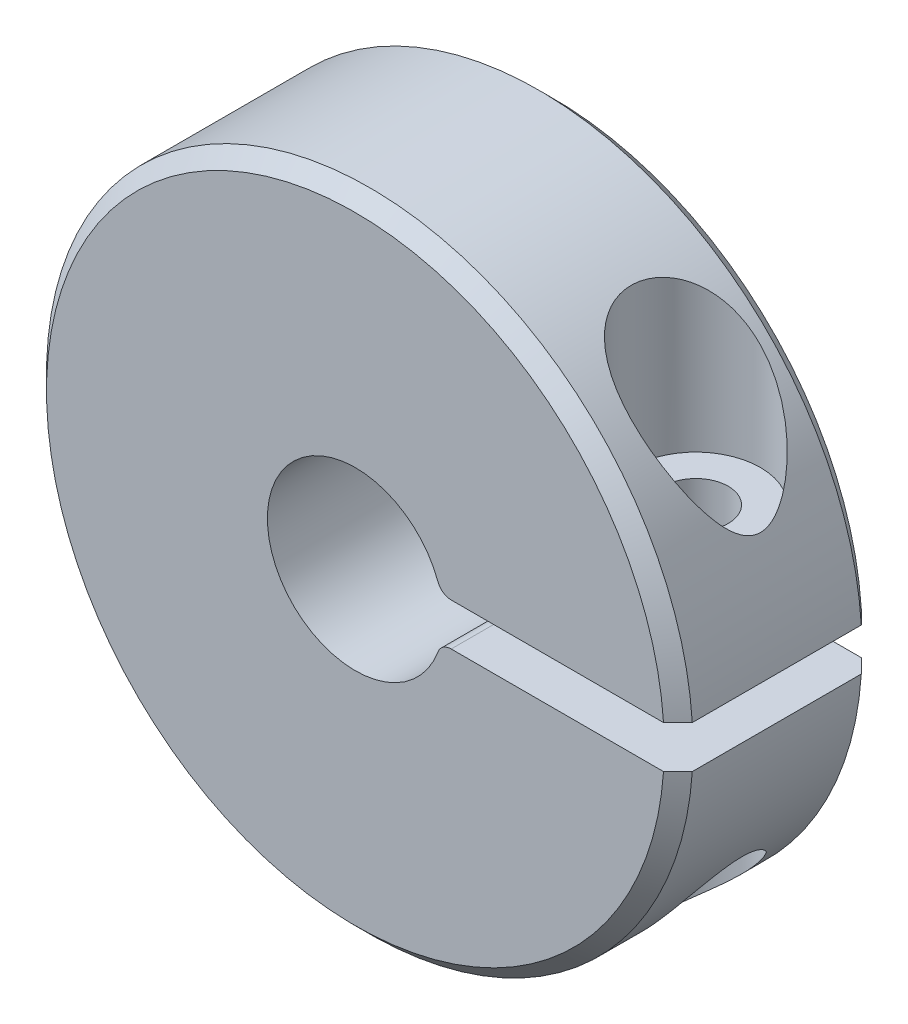
ISO-10303-21;
HEADER;
FILE_DESCRIPTION(('STEP AP214'),'2;1');
FILE_NAME('part.step','',(''),(''),'','','');
FILE_SCHEMA(('AUTOMOTIVE_DESIGN { 1 0 10303 214 1 1 1 1 }'));
ENDSEC;
DATA;
#1=APPLICATION_CONTEXT('core data for automotive mechanical design processes');
#2=APPLICATION_PROTOCOL_DEFINITION('international standard','automotive_design',2000,#1);
#3=PRODUCT_CONTEXT('',#1,'mechanical');
#4=PRODUCT('Part','Part','',(#3));
#5=PRODUCT_RELATED_PRODUCT_CATEGORY('part','',(#4));
#6=PRODUCT_DEFINITION_FORMATION('','',#4);
#7=PRODUCT_DEFINITION_CONTEXT('part definition',#1,'design');
#8=PRODUCT_DEFINITION('design','',#6,#7);
#9=PRODUCT_DEFINITION_SHAPE('','',#8);
#10=(LENGTH_UNIT() NAMED_UNIT(*) SI_UNIT(.MILLI.,.METRE.));
#11=(NAMED_UNIT(*) PLANE_ANGLE_UNIT() SI_UNIT($,.RADIAN.));
#12=(NAMED_UNIT(*) SI_UNIT($,.STERADIAN.) SOLID_ANGLE_UNIT());
#13=UNCERTAINTY_MEASURE_WITH_UNIT(LENGTH_MEASURE(1.E-05),#10,'distance_accuracy_value','');
#14=(GEOMETRIC_REPRESENTATION_CONTEXT(3) GLOBAL_UNCERTAINTY_ASSIGNED_CONTEXT((#13)) GLOBAL_UNIT_ASSIGNED_CONTEXT((#10,
#11,#12)) REPRESENTATION_CONTEXT('',''));
#15=CARTESIAN_POINT('',(0.,0.,0.));
#16=DIRECTION('',(0.,0.,1.));
#17=DIRECTION('',(1.,0.,0.));
#18=AXIS2_PLACEMENT_3D('',#15,#16,#17);
#19=CARTESIAN_POINT('',(0.,0.,0.));
#20=DIRECTION('',(0.,0.,1.));
#21=DIRECTION('',(1.,0.,0.));
#22=AXIS2_PLACEMENT_3D('',#19,#20,#21);
#23=PLANE('',#22);
#24=DIRECTION('',(-1.,0.,0.));
#25=VECTOR('',#24,1.);
#26=CARTESIAN_POINT('',(3.0197569852556,-0.75,0.));
#27=LINE('',#26,#25);
#28=CARTESIAN_POINT('',(10.9042377083407,-0.75,0.));
#29=VERTEX_POINT('',#28);
#30=CARTESIAN_POINT('',(3.38827865589594,-0.75,0.));
#31=VERTEX_POINT('',#30);
#32=EDGE_CURVE('E119',#29,#31,#27,.T.);
#33=ORIENTED_EDGE('',*,*,#32,.F.);
#34=CARTESIAN_POINT('',(0.,0.,0.));
#35=DIRECTION('',(0.,0.,1.));
#36=DIRECTION('',(1.,0.,0.));
#37=AXIS2_PLACEMENT_3D('',#34,#35,#36);
#38=CIRCLE('',#37,10.93);
#39=CARTESIAN_POINT('',(10.9042377083407,0.75,0.));
#40=VERTEX_POINT('',#39);
#41=EDGE_CURVE('E48',#29,#40,#38,.F.);
#42=ORIENTED_EDGE('',*,*,#41,.T.);
#43=DIRECTION('',(1.,0.,0.));
#44=VECTOR('',#43,1.);
#45=CARTESIAN_POINT('',(3.0197569852556,0.75,0.));
#46=LINE('',#45,#44);
#47=CARTESIAN_POINT('',(3.38827865589594,0.75,0.));
#48=VERTEX_POINT('',#47);
#49=EDGE_CURVE('E124',#48,#40,#46,.T.);
#50=ORIENTED_EDGE('',*,*,#49,.F.);
#51=CARTESIAN_POINT('',(3.38827865589594,1.25,0.));
#52=DIRECTION('',(0.,0.,1.));
#53=DIRECTION('',(1.,0.,0.));
#54=AXIS2_PLACEMENT_3D('',#51,#52,#53);
#55=CIRCLE('',#54,0.5);
#56=CARTESIAN_POINT('',(2.91918289846884,1.07694171396926,0.));
#57=VERTEX_POINT('',#56);
#58=EDGE_CURVE('E123',#48,#57,#55,.F.);
#59=ORIENTED_EDGE('',*,*,#58,.T.);
#60=CARTESIAN_POINT('',(0.,0.,0.));
#61=DIRECTION('',(0.,0.,-1.));
#62=DIRECTION('',(1.,0.,0.));
#63=AXIS2_PLACEMENT_3D('',#60,#61,#62);
#64=CIRCLE('',#63,3.1115);
#65=CARTESIAN_POINT('',(2.91918289846884,-1.07694171396926,0.));
#66=VERTEX_POINT('',#65);
#67=EDGE_CURVE('E109',#66,#57,#64,.T.);
#68=ORIENTED_EDGE('',*,*,#67,.F.);
#69=CARTESIAN_POINT('',(3.38827865589594,-1.25,0.));
#70=DIRECTION('',(0.,0.,1.));
#71=DIRECTION('',(1.,0.,0.));
#72=AXIS2_PLACEMENT_3D('',#69,#70,#71);
#73=CIRCLE('',#72,0.5);
#74=EDGE_CURVE('E140',#66,#31,#73,.F.);
#75=ORIENTED_EDGE('',*,*,#74,.T.);
#76=EDGE_LOOP('',(#33,#42,#50,#59,#68,#75));
#77=FACE_BOUND('',#76,.T.);
#78=ADVANCED_FACE('F34',(#77),#23,.F.);
#79=CARTESIAN_POINT('',(0.,0.,6.985));
#80=DIRECTION('',(0.,0.,-1.));
#81=DIRECTION('',(-1.,0.,0.));
#82=AXIS2_PLACEMENT_3D('',#79,#80,#81);
#83=CYLINDRICAL_SURFACE('',#82,3.1115);
#84=ORIENTED_EDGE('',*,*,#67,.T.);
#85=DIRECTION('',(0.,0.,-1.));
#86=VECTOR('',#85,1.);
#87=CARTESIAN_POINT('',(2.91918289846884,1.07694171396926,6.985));
#88=LINE('',#87,#86);
#89=CARTESIAN_POINT('',(2.91918289846884,1.07694171396926,6.985));
#90=VERTEX_POINT('',#89);
#91=EDGE_CURVE('E114',#57,#90,#88,.F.);
#92=ORIENTED_EDGE('',*,*,#91,.T.);
#93=CARTESIAN_POINT('',(0.,0.,6.985));
#94=DIRECTION('',(0.,0.,-1.));
#95=DIRECTION('',(1.,0.,0.));
#96=AXIS2_PLACEMENT_3D('',#93,#94,#95);
#97=CIRCLE('',#96,3.1115);
#98=CARTESIAN_POINT('',(2.91918289846884,-1.07694171396926,6.985));
#99=VERTEX_POINT('',#98);
#100=EDGE_CURVE('E391',#99,#90,#97,.T.);
#101=ORIENTED_EDGE('',*,*,#100,.F.);
#102=DIRECTION('',(0.,0.,-1.));
#103=VECTOR('',#102,1.);
#104=CARTESIAN_POINT('',(2.91918289846884,-1.07694171396926,6.985));
#105=LINE('',#104,#103);
#106=EDGE_CURVE('E117',#99,#66,#105,.T.);
#107=ORIENTED_EDGE('',*,*,#106,.T.);
#108=EDGE_LOOP('',(#84,#92,#101,#107));
#109=FACE_BOUND('',#108,.T.);
#110=ADVANCED_FACE('F111',(#109),#83,.F.);
#111=CARTESIAN_POINT('',(3.0197569852556,0.75,6.985));
#112=DIRECTION('',(0.,1.,0.));
#113=DIRECTION('',(0.,0.,1.));
#114=AXIS2_PLACEMENT_3D('',#111,#112,#113);
#115=PLANE('',#114);
#116=CARTESIAN_POINT('',(8.23036715761488,0.750000000000001,3.175));
#117=DIRECTION('',(0.,1.,0.));
#118=DIRECTION('',(0.,0.,1.));
#119=AXIS2_PLACEMENT_3D('',#116,#117,#118);
#120=CIRCLE('',#119,1.143);
#121=CARTESIAN_POINT('',(8.23036715761488,0.750000000000001,4.318));
#122=VERTEX_POINT('',#121);
#123=EDGE_CURVE('E120',#122,#122,#120,.T.);
#124=ORIENTED_EDGE('',*,*,#123,.T.);
#125=EDGE_LOOP('',(#124));
#126=FACE_BOUND('',#125,.T.);
#127=ORIENTED_EDGE('',*,*,#49,.T.);
#128=CARTESIAN_POINT('',(10.9042377083407,0.75,0.));
#129=CARTESIAN_POINT('',(10.9877634973014,0.75,0.0833291097349452));
#130=CARTESIAN_POINT('',(11.0712871792218,0.75,0.166660331269681));
#131=CARTESIAN_POINT('',(11.2383303289798,0.75,0.333326997936349));
#132=CARTESIAN_POINT('',(11.3218497968174,0.75,0.416662443068283));
#133=CARTESIAN_POINT('',(11.4053671576149,0.75,0.500000000000006));
#134=B_SPLINE_CURVE_WITH_KNOTS('',3,(#128,#129,#130,#131,#132,#133),.UNSPECIFIED.,.F.,.F.,(4,2,
4),(0.,0.353952936583566,0.707905873157012),.UNSPECIFIED.);
#135=CARTESIAN_POINT('',(11.4053671576149,0.75,0.500000000000006));
#136=VERTEX_POINT('',#135);
#137=EDGE_CURVE('E11',#40,#136,#134,.T.);
#138=ORIENTED_EDGE('',*,*,#137,.T.);
#139=DIRECTION('',(0.,0.,-1.));
#140=VECTOR('',#139,1.);
#141=CARTESIAN_POINT('',(11.4053671576149,0.75,6.985));
#142=LINE('',#141,#140);
#143=CARTESIAN_POINT('',(11.4053671576149,0.75,6.47699999999999));
#144=VERTEX_POINT('',#143);
#145=EDGE_CURVE('E369',#144,#136,#142,.T.);
#146=ORIENTED_EDGE('',*,*,#145,.F.);
#147=CARTESIAN_POINT('',(11.4053671576149,0.75,6.47699999999999));
#148=CARTESIAN_POINT('',(11.3205134517311,0.75,6.56167103127841));
#149=CARTESIAN_POINT('',(11.2356575684629,0.75,6.64633988025031));
#150=CARTESIAN_POINT('',(11.0659414471552,0.75,6.81567321358365));
#151=CARTESIAN_POINT('',(10.9810812091156,0.75,6.90033769794508));
#152=CARTESIAN_POINT('',(10.8962187936917,0.75,6.985));
#153=B_SPLINE_CURVE_WITH_KNOTS('',3,(#147,#148,#149,#150,#151,#152),.UNSPECIFIED.,.F.,.F.,(4,2,
4),(0.,0.359616482107068,0.719232964224946),.UNSPECIFIED.);
#154=CARTESIAN_POINT('',(10.8962187936917,0.75,6.985));
#155=VERTEX_POINT('',#154);
#156=EDGE_CURVE('E186',#144,#155,#153,.T.);
#157=ORIENTED_EDGE('',*,*,#156,.T.);
#158=DIRECTION('',(1.,0.,0.));
#159=VECTOR('',#158,1.);
#160=CARTESIAN_POINT('',(3.0197569852556,0.75,6.985));
#161=LINE('',#160,#159);
#162=CARTESIAN_POINT('',(3.38827865589594,0.75,6.985));
#163=VERTEX_POINT('',#162);
#164=EDGE_CURVE('E384',#163,#155,#161,.T.);
#165=ORIENTED_EDGE('',*,*,#164,.F.);
#166=DIRECTION('',(0.,0.,-1.));
#167=VECTOR('',#166,1.);
#168=CARTESIAN_POINT('',(3.38827865589594,0.75,6.985));
#169=LINE('',#168,#167);
#170=EDGE_CURVE('E135',#163,#48,#169,.T.);
#171=ORIENTED_EDGE('',*,*,#170,.T.);
#172=EDGE_LOOP('',(#127,#138,#146,#157,#165,#171));
#173=FACE_BOUND('',#172,.T.);
#174=ADVANCED_FACE('F192',(#126,#173),#115,.F.);
#175=CARTESIAN_POINT('',(0.,0.,6.985));
#176=DIRECTION('',(0.,0.,-1.));
#177=DIRECTION('',(-1.,0.,0.));
#178=AXIS2_PLACEMENT_3D('',#175,#176,#177);
#179=CYLINDRICAL_SURFACE('',#178,11.43);
#180=CARTESIAN_POINT('',(8.23036715761488,-7.93132753395385,4.953));
#181=CARTESIAN_POINT('',(8.30498156702307,-7.85390060478297,4.95300015319294));
#182=CARTESIAN_POINT('',(8.37848766170207,-7.77543076387292,4.94831035981302));
#183=CARTESIAN_POINT('',(8.52278199487194,-7.61699217717442,4.93029625105767));
#184=CARTESIAN_POINT('',(8.59356979106828,-7.53702319058366,4.91697053678377));
#185=CARTESIAN_POINT('',(8.73240097449314,-7.37573434677353,4.8821600841793));
#186=CARTESIAN_POINT('',(8.80042778952019,-7.29440957074977,4.86063238925259));
#187=CARTESIAN_POINT('',(8.93302330834566,-7.13141145130914,4.80980854405525));
#188=CARTESIAN_POINT('',(8.99759287854975,-7.04973820081397,4.78051435117024));
#189=CARTESIAN_POINT('',(9.12456815557469,-6.8846396360857,4.71349588596624));
#190=CARTESIAN_POINT('',(9.18688227898052,-6.8012203408616,4.67558290897706));
#191=CARTESIAN_POINT('',(9.30736937209283,-6.63538101006212,4.59159779358892));
#192=CARTESIAN_POINT('',(9.36553948524012,-6.55296169565356,4.54552010192906));
#193=CARTESIAN_POINT('',(9.4769159509464,-6.39081957359175,4.44503678667072));
#194=CARTESIAN_POINT('',(9.53015196260096,-6.31108277796456,4.39068692833612));
#195=CARTESIAN_POINT('',(9.63137096654851,-6.15549811581259,4.27250931045424));
#196=CARTESIAN_POINT('',(9.67936293591305,-6.07964372539096,4.20869820318048));
#197=CARTESIAN_POINT('',(9.75324731376263,-5.96004609972014,4.09423239346201));
#198=CARTESIAN_POINT('',(9.7809898409012,-5.91436654782216,4.04680545030249));
#199=CARTESIAN_POINT('',(9.83324515467069,-5.82707227063173,3.94653549681379));
#200=CARTESIAN_POINT('',(9.85775468339499,-5.78546165638135,3.89368711715825));
#201=CARTESIAN_POINT('',(9.90288527942073,-5.70787156167318,3.78136355874434));
#202=CARTESIAN_POINT('',(9.92345826443013,-5.6719625251615,3.72181901083114));
#203=CARTESIAN_POINT('',(9.95891192525704,-5.60948044989559,3.59644962915283));
#204=CARTESIAN_POINT('',(9.97380999941738,-5.58287889669798,3.53064477662695));
#205=CARTESIAN_POINT('',(9.99277857817222,-5.54883193657383,3.41480962840096));
#206=CARTESIAN_POINT('',(9.99876580717983,-5.53801816257598,3.36609252106549));
#207=CARTESIAN_POINT('',(10.0066601306054,-5.52374178058576,3.26727529213453));
#208=CARTESIAN_POINT('',(10.0085714009144,-5.52027164893144,3.21717663932785));
#209=CARTESIAN_POINT('',(10.0081277217503,-5.52107592425294,3.11700270312292));
#210=CARTESIAN_POINT('',(10.0057676416535,-5.52535964493488,3.06692752019293));
#211=CARTESIAN_POINT('',(9.99700769379174,-5.54119261630438,2.96830045573627));
#212=CARTESIAN_POINT('',(9.99060381493081,-5.5527490808816,2.91975013699425));
#213=CARTESIAN_POINT('',(9.97169106662201,-5.58665877594799,2.81021698289553));
#214=CARTESIAN_POINT('',(9.95789105066927,-5.61127223811481,2.75016629407419));
#215=CARTESIAN_POINT('',(9.92553435821117,-5.66831082275655,2.63530181941104));
#216=CARTESIAN_POINT('',(9.9069665675598,-5.70075418672408,2.58050068627806));
#217=CARTESIAN_POINT('',(9.85299884609691,-5.79376682196334,2.4422687217776));
#218=CARTESIAN_POINT('',(9.81447491265942,-5.85896451457133,2.36321793732949));
#219=CARTESIAN_POINT('',(9.73047284261003,-5.99745221334292,2.21682062110648));
#220=CARTESIAN_POINT('',(9.68497500496431,-6.07076497595306,2.14950843964278));
#221=CARTESIAN_POINT('',(9.59393206979153,-6.21351114598652,2.03182349501006));
#222=CARTESIAN_POINT('',(9.54896499676116,-6.2824569472025,1.98039751909401));
#223=CARTESIAN_POINT('',(9.45525586749231,-6.42262823011024,1.8844843367477));
#224=CARTESIAN_POINT('',(9.4065111029821,-6.49385532541913,1.84000217858842));
#225=CARTESIAN_POINT('',(9.30558210452859,-6.63767801250218,1.75745006784683));
#226=CARTESIAN_POINT('',(9.25339473281035,-6.71027480844339,1.71938608068421));
#227=CARTESIAN_POINT('',(9.14586140062951,-6.85611652228672,1.64946159809621));
#228=CARTESIAN_POINT('',(9.09051504942555,-6.92936151941544,1.61760187224968));
#229=CARTESIAN_POINT('',(8.97360515710522,-7.08017766228679,1.55839390555201));
#230=CARTESIAN_POINT('',(8.91186707647607,-7.15775664109912,1.53140791471579));
#231=CARTESIAN_POINT('',(8.78532637842617,-7.31252130478226,1.48447979018282));
#232=CARTESIAN_POINT('',(8.72052328008479,-7.38970692581397,1.46453876607107));
#233=CARTESIAN_POINT('',(8.52201416226555,-7.61977317575457,1.41579933585821));
#234=CARTESIAN_POINT('',(8.38394797035212,-7.77150075150451,1.39795126584669));
#235=CARTESIAN_POINT('',(8.1297251822334,-8.03609249868624,1.39631572617285));
#236=CARTESIAN_POINT('',(8.01509266325347,-8.15040167635492,1.40613596920461));
#237=CARTESIAN_POINT('',(7.78345423013067,-8.37187166807832,1.45006324904879));
#238=CARTESIAN_POINT('',(7.66645143411815,-8.47904116740095,1.48414016555304));
#239=CARTESIAN_POINT('',(7.46138299809849,-8.65949549899148,1.56899058559326));
#240=CARTESIAN_POINT('',(7.37285617312702,-8.73490149368641,1.61411481845311));
#241=CARTESIAN_POINT('',(7.20029143832689,-8.8776783532427,1.72222419802365));
#242=CARTESIAN_POINT('',(7.11624777284196,-8.94505966461449,1.78518575503406));
#243=CARTESIAN_POINT('',(6.97167826059411,-9.05800324389113,1.91617014740094));
#244=CARTESIAN_POINT('',(6.90968534123564,-9.10529286953045,1.98107459169682));
#245=CARTESIAN_POINT('',(6.79419318404309,-9.19179196293739,2.12284389575808));
#246=CARTESIAN_POINT('',(6.74069176232339,-9.23100350904132,2.19970567017529));
#247=CARTESIAN_POINT('',(6.64482062781051,-9.30025814618255,2.36475617285975));
#248=CARTESIAN_POINT('',(6.60253501609675,-9.33023222730692,2.45302348208646));
#249=CARTESIAN_POINT('',(6.53253569691038,-9.3793780658839,2.63796990936962));
#250=CARTESIAN_POINT('',(6.50481106470971,-9.39855792274061,2.73464265738475));
#251=CARTESIAN_POINT('',(6.4685339805702,-9.42355483010859,2.92007640609214));
#252=CARTESIAN_POINT('',(6.4579783226267,-9.43077046232767,3.0082614623287));
#253=CARTESIAN_POINT('',(6.45019100170494,-9.43609903797309,3.18547594998551));
#254=CARTESIAN_POINT('',(6.45295315241619,-9.434216207763,3.27450497019503));
#255=CARTESIAN_POINT('',(6.47099280118947,-9.42184974245136,3.44467881399599));
#256=CARTESIAN_POINT('',(6.48543444379719,-9.41194045782524,3.52595683904352));
#257=CARTESIAN_POINT('',(6.52498057260347,-9.38456722641019,3.68452717372675));
#258=CARTESIAN_POINT('',(6.55008499952599,-9.36710332161853,3.76181950551685));
#259=CARTESIAN_POINT('',(6.61046951277237,-9.32459016330615,3.91254967265607));
#260=CARTESIAN_POINT('',(6.64599669854337,-9.29935587051818,3.98583548242593));
#261=CARTESIAN_POINT('',(6.72526760034605,-9.24218913138089,4.1249345259963));
#262=CARTESIAN_POINT('',(6.76901345213371,-9.21025494370098,4.19074581026911));
#263=CARTESIAN_POINT('',(6.86782350412642,-9.13685140617761,4.32045845149699));
#264=CARTESIAN_POINT('',(6.92359065399147,-9.0947371026394,4.38345633929457));
#265=CARTESIAN_POINT('',(7.04072342703567,-9.00436597668912,4.49893818672953));
#266=CARTESIAN_POINT('',(7.10209325451338,-8.95610453049541,4.55141415466344));
#267=CARTESIAN_POINT('',(7.25739819521559,-8.83113612272893,4.66759498647417));
#268=CARTESIAN_POINT('',(7.35338400673661,-8.75151864654828,4.72544910699523));
#269=CARTESIAN_POINT('',(7.54825962205226,-8.58401184268237,4.82054406336446));
#270=CARTESIAN_POINT('',(7.64715351861821,-8.49611043137558,4.85775422428423));
#271=CARTESIAN_POINT('',(7.82773885706582,-8.32969732868684,4.90890417184893));
#272=CARTESIAN_POINT('',(7.90950760998705,-8.25211608066446,4.92571743715657));
#273=CARTESIAN_POINT('',(8.07138500208836,-8.09385196481786,4.94775924729684));
#274=CARTESIAN_POINT('',(8.15149528141126,-8.01317241111403,4.95299983806592));
#275=CARTESIAN_POINT('',(8.23036715761488,-7.93132753395385,4.953));
#276=B_SPLINE_CURVE_WITH_KNOTS('',3,(#180,#181,#182,#183,#184,#185,#186,#187,#188,#189,#190,
#191,#192,#193,#194,#195,#196,#197,#198,#199,#200,#201,#202,#203,#204,#205,#206,#207,#208,#209,
#210,#211,#212,#213,#214,#215,#216,#217,#218,#219,#220,#221,#222,#223,#224,#225,#226,#227,#228,
#229,#230,#231,#232,#233,#234,#235,#236,#237,#238,#239,#240,#241,#242,#243,#244,#245,#246,#247,
#248,#249,#250,#251,#252,#253,#254,#255,#256,#257,#258,#259,#260,#261,#262,#263,#264,#265,#266,
#267,#268,#269,#270,#271,#272,#273,#274,#275),.UNSPECIFIED.,.T.,.F.,(4,2,2,2,2,2,2,2,2,2,2,2,2,
2,2,2,2,2,2,2,2,2,2,2,2,2,2,2,2,2,2,2,2,2,2,2,2,2,2,2,2,2,2,2,2,2,2,4),(0.,0.322458365177513,
0.644968977163604,0.969192438749432,1.29333426405003,1.62540605290451,1.95770457468846,
2.28785481221118,2.61743071892641,2.83149164087188,3.04576665134073,3.2625117721797,
3.47858693481694,3.62873318291014,3.77872552950081,3.92889816219173,4.07921998754059,
4.27714858291146,4.47554282533674,4.80212534606118,5.12964805876159,5.4204240981171,
5.71141056170902,6.00266601167231,6.2939575660894,6.6019093241029,6.90990956303729,
7.52458295771677,8.00955761180689,8.49393110510569,8.86680315109142,9.23918436081881,
9.54231867905976,9.84537490893384,10.1506431570738,10.455682041933,10.7215898159569,
10.9873740839619,11.2356617712811,11.4839480783493,11.7386759171658,11.9934700430063,
12.2746485587357,12.556039835404,12.9662013883831,13.3769707805394,13.7181838189237,
14.0590415226947),.UNSPECIFIED.);
#277=CARTESIAN_POINT('',(9.30991895442998,-6.63101116436592,1.76225376730522));
#278=VERTEX_POINT('',#277);
#279=CARTESIAN_POINT('',(9.30991895442998,-6.63101116436592,4.58774623269477));
#280=VERTEX_POINT('',#279);
#281=EDGE_CURVE('E357',#278,#280,#276,.T.);
#282=ORIENTED_EDGE('',*,*,#281,.T.);
#283=CARTESIAN_POINT('',(9.30991895442998,-6.63101116436592,4.58774623269477));
#284=CARTESIAN_POINT('',(9.34860172966801,-6.57671563210915,4.54609376829998));
#285=CARTESIAN_POINT('',(9.38605578494384,-6.52310989177789,4.50228442355549));
#286=CARTESIAN_POINT('',(9.45834710551006,-6.41783594975969,4.40971164153865));
#287=CARTESIAN_POINT('',(9.49316914417179,-6.366179777092,4.36092272400773));
#288=CARTESIAN_POINT('',(9.56031316886299,-6.26490939746152,4.25710681842663));
#289=CARTESIAN_POINT('',(9.59256681044042,-6.21536136978365,4.20196983346022));
#290=CARTESIAN_POINT('',(9.6530444055302,-6.1210096111039,4.08592465814862));
#291=CARTESIAN_POINT('',(9.68127794462705,-6.07619466276216,4.02503079230288));
#292=CARTESIAN_POINT('',(9.7303705828982,-5.99722752316016,3.90315250536489));
#293=CARTESIAN_POINT('',(9.75168016687586,-5.96246186703214,3.84275496733393));
#294=CARTESIAN_POINT('',(9.78930955715886,-5.9004770861403,3.71700481993354));
#295=CARTESIAN_POINT('',(9.80565090708278,-5.87322542796712,3.65167518348863));
#296=CARTESIAN_POINT('',(9.83249975346793,-5.82816932186818,3.5155156615809));
#297=CARTESIAN_POINT('',(9.84292201155361,-5.81050306292386,3.44462136654043));
#298=CARTESIAN_POINT('',(9.85643766165185,-5.78754972308014,3.30015302539001));
#299=CARTESIAN_POINT('',(9.85953897096054,-5.78224926915888,3.22658196163833));
#300=CARTESIAN_POINT('',(9.85813233071163,-5.78464494899835,3.08925117997719));
#301=CARTESIAN_POINT('',(9.85455220420418,-5.79075642098756,3.02544719014042));
#302=CARTESIAN_POINT('',(9.84191009535912,-5.81221616863945,2.89997452434056));
#303=CARTESIAN_POINT('',(9.83284354895811,-5.82757213459135,2.83830767143301));
#304=CARTESIAN_POINT('',(9.80652387688038,-5.87178198768337,2.70049605395609));
#305=CARTESIAN_POINT('',(9.78763383253516,-5.90329843036484,2.62553296057192));
#306=CARTESIAN_POINT('',(9.7435206993415,-5.9758262260781,2.48232802069673));
#307=CARTESIAN_POINT('',(9.71828074845739,-6.01686283674663,2.41410475431334));
#308=CARTESIAN_POINT('',(9.66824573129171,-6.09686035995054,2.29697780162483));
#309=CARTESIAN_POINT('',(9.64431694582055,-6.13467556728593,2.24689580457777));
#310=CARTESIAN_POINT('',(9.59372170236389,-6.21350117956463,2.15075055925225));
#311=CARTESIAN_POINT('',(9.56705333308694,-6.2545138103392,2.10469015868747));
#312=CARTESIAN_POINT('',(9.51136012286483,-6.33888684250905,2.01633816204592));
#313=CARTESIAN_POINT('',(9.48233553576318,-6.38224699083094,1.97404616101344));
#314=CARTESIAN_POINT('',(9.42219380465488,-6.47070482657358,1.89296876452814));
#315=CARTESIAN_POINT('',(9.39107751227144,-6.51580180370082,1.85418195685945));
#316=CARTESIAN_POINT('',(9.34288010174064,-6.58454904931113,1.79836570373282));
#317=CARTESIAN_POINT('',(9.32651454980965,-6.60771199297185,1.78010855491138));
#318=CARTESIAN_POINT('',(9.30991895442998,-6.63101116436592,1.76225376730523));
#319=B_SPLINE_CURVE_WITH_KNOTS('',3,(#283,#284,#285,#286,#287,#288,#289,#290,#291,#292,#293,
#294,#295,#296,#297,#298,#299,#300,#301,#302,#303,#304,#305,#306,#307,#308,#309,#310,#311,#312,
#313,#314,#315,#316,#317,#318),.UNSPECIFIED.,.F.,.F.,(4,2,2,2,2,2,2,2,2,2,2,2,2,2,2,2,2,4),(0.,
0.23587557875659,0.47302518249813,0.715184031854365,0.956755442025457,1.17479016876487,
1.39186549047713,1.6119923386014,1.83188101958039,2.02347388333752,2.2152263496073,
2.46429129579014,2.71402474129635,2.91523895533362,3.11659451383761,3.31792840832493,
3.51918082186805,3.62035073833998),.UNSPECIFIED.);
#320=EDGE_CURVE('E371',#280,#278,#319,.T.);
#321=ORIENTED_EDGE('',*,*,#320,.T.);
#322=EDGE_LOOP('',(#282,#321));
#323=FACE_BOUND('',#322,.T.);
#324=CARTESIAN_POINT('',(8.23036715761488,7.93132753395385,0.889));
#325=CARTESIAN_POINT('',(8.32636414962857,7.83172121993594,0.888997693683112));
#326=CARTESIAN_POINT('',(8.42046203131274,7.7304431295408,0.895032139815843));
#327=CARTESIAN_POINT('',(8.60439554966201,7.52517302696768,0.917903948622648));
#328=CARTESIAN_POINT('',(8.69422956666565,7.42118000638814,0.934745381695788));
#329=CARTESIAN_POINT('',(8.86921657101917,7.21114584585052,0.978227385988428));
#330=CARTESIAN_POINT('',(8.95436374995744,7.10510237521625,1.0048798150848));
#331=CARTESIAN_POINT('',(9.11958311106477,6.8917560175368,1.06718501908089));
#332=CARTESIAN_POINT('',(9.19965608519275,6.7844533301382,1.10283638511745));
#333=CARTESIAN_POINT('',(9.35720749289252,6.56554422561263,1.18398318666731));
#334=CARTESIAN_POINT('',(9.43450356591628,6.45391611542811,1.22977356321609));
#335=CARTESIAN_POINT('',(9.58333093177759,6.23078218692261,1.33018386899146));
#336=CARTESIAN_POINT('',(9.65486216933496,6.11927636978443,1.38480388287213));
#337=CARTESIAN_POINT('',(9.79201093308256,5.89732575168005,1.50309283295238));
#338=CARTESIAN_POINT('',(9.85762522131269,5.78688156085243,1.56676667520022));
#339=CARTESIAN_POINT('',(9.98256425708172,5.56857886781973,1.70387190258062));
#340=CARTESIAN_POINT('',(10.0418943529837,5.46071822830573,1.7772948684835));
#341=CARTESIAN_POINT('',(10.1273271995056,5.29963602326673,1.89830508406929));
#342=CARTESIAN_POINT('',(10.1559134934601,5.24461708216047,1.94176376929039));
#343=CARTESIAN_POINT('',(10.2109881190343,5.13656390647928,2.03230671858172));
#344=CARTESIAN_POINT('',(10.237477334353,5.08352884093222,2.07938943882642));
#345=CARTESIAN_POINT('',(10.2879943371687,4.98049683156933,2.17750419010713));
#346=CARTESIAN_POINT('',(10.312033029931,4.93048687003126,2.22851677463074));
#347=CARTESIAN_POINT('',(10.3573602027317,4.83454172400725,2.33532138122816));
#348=CARTESIAN_POINT('',(10.3786521048313,4.78860149210183,2.39110730942501));
#349=CARTESIAN_POINT('',(10.4147503269429,4.7095072478504,2.49900649609381));
#350=CARTESIAN_POINT('',(10.4300497847138,4.67548023910579,2.55030439280722));
#351=CARTESIAN_POINT('',(10.4576525083739,4.61341059533584,2.65726901136677));
#352=CARTESIAN_POINT('',(10.4699547754273,4.5853699556963,2.71293718148902));
#353=CARTESIAN_POINT('',(10.4908711302313,4.53731482848767,2.8293746890088));
#354=CARTESIAN_POINT('',(10.499430336859,4.51742002833546,2.89020526276381));
#355=CARTESIAN_POINT('',(10.51160706079,4.48901696834806,3.01490596207223));
#356=CARTESIAN_POINT('',(10.5152381740965,4.48047738219892,3.07876721980907));
#357=CARTESIAN_POINT('',(10.5169331346202,4.4764959698581,3.1990666645496));
#358=CARTESIAN_POINT('',(10.5156282788576,4.47956888325469,3.25544913975697));
#359=CARTESIAN_POINT('',(10.5089999896665,4.49509579901969,3.36668318704502));
#360=CARTESIAN_POINT('',(10.5036713273163,4.50756200789534,3.4215326707506));
#361=CARTESIAN_POINT('',(10.4877920774944,4.54440350695454,3.54154076232654));
#362=CARTESIAN_POINT('',(10.4762742113532,4.57096547272583,3.60588273223782));
#363=CARTESIAN_POINT('',(10.4490655260904,4.63282487937758,3.72924798569452));
#364=CARTESIAN_POINT('',(10.4333649603755,4.66814270979953,3.78825840986506));
#365=CARTESIAN_POINT('',(10.4006812800855,4.74047769450441,3.89492203550244));
#366=CARTESIAN_POINT('',(10.3840319967768,4.77687503037984,3.94310953528555));
#367=CARTESIAN_POINT('',(10.3486402450484,4.85307313850625,4.03591788965024));
#368=CARTESIAN_POINT('',(10.329896051226,4.89287670977254,4.08053575155196));
#369=CARTESIAN_POINT('',(10.2709267033806,5.01609558209135,4.20986240144403));
#370=CARTESIAN_POINT('',(10.2280281959084,5.10317648342678,4.28984976906419));
#371=CARTESIAN_POINT('',(10.1351617769866,5.28528382174266,4.44217238179193));
#372=CARTESIAN_POINT('',(10.0850170400191,5.38047224617806,4.51419667812362));
#373=CARTESIAN_POINT('',(9.97931330212533,5.57408150727301,4.64956942127712));
#374=CARTESIAN_POINT('',(9.92374920190341,5.67250532939065,4.71290955938218));
#375=CARTESIAN_POINT('',(9.80753602444396,5.87115021636255,4.83188006347433));
#376=CARTESIAN_POINT('',(9.7468813301298,5.97137316799615,4.88750172835499));
#377=CARTESIAN_POINT('',(9.62072660599924,6.17257029522168,4.99141733569487));
#378=CARTESIAN_POINT('',(9.55522610491875,6.27354454301746,5.03971056405229));
#379=CARTESIAN_POINT('',(9.41331779432269,6.48474943276447,5.13313261721037));
#380=CARTESIAN_POINT('',(9.33646006233653,6.59498416807308,5.17757085545323));
#381=CARTESIAN_POINT('',(9.17727088359619,6.81476476564119,5.25757159440429));
#382=CARTESIAN_POINT('',(9.09493823735166,6.92431047114975,5.29313214194606));
#383=CARTESIAN_POINT('',(8.92514219560905,7.141829769752,5.35473054971694));
#384=CARTESIAN_POINT('',(8.83768720577801,7.24980559454853,5.3807835302608));
#385=CARTESIAN_POINT('',(8.65789237999909,7.46359968591319,5.42256119807208));
#386=CARTESIAN_POINT('',(8.5655542304069,7.56941868005837,5.43828942605599));
#387=CARTESIAN_POINT('',(8.32941879897965,7.83007185121137,5.4632887959972));
#388=CARTESIAN_POINT('',(8.18282873056007,7.98316448812549,5.46547998382709));
#389=CARTESIAN_POINT('',(7.88265443986416,8.27967200812631,5.4394031824134));
#390=CARTESIAN_POINT('',(7.72907874063893,8.42309818133357,5.41117140505771));
#391=CARTESIAN_POINT('',(7.45485187059266,8.66578437981507,5.32907346910662));
#392=CARTESIAN_POINT('',(7.33449674949657,8.76776042931486,5.28232884773425));
#393=CARTESIAN_POINT('',(7.09702083315951,8.96105511352593,5.16467781429261));
#394=CARTESIAN_POINT('',(6.97989600066782,9.05238755874604,5.09380319117555));
#395=CARTESIAN_POINT('',(6.77508764416475,9.2063267756879,4.94167473659113));
#396=CARTESIAN_POINT('',(6.6859249022615,9.27113650990131,4.86465608335721));
#397=CARTESIAN_POINT('',(6.51741858774962,9.39035648215403,4.69355042907402));
#398=CARTESIAN_POINT('',(6.43807251511302,9.44476936990573,4.59946778885311));
#399=CARTESIAN_POINT('',(6.29296100701093,9.54207834804377,4.39486891221296));
#400=CARTESIAN_POINT('',(6.2272906857214,9.58489436328711,4.28424621196217));
#401=CARTESIAN_POINT('',(6.1144468044691,9.65727587991939,4.0499536764605));
#402=CARTESIAN_POINT('',(6.06726210948786,9.68684935963374,3.92629175268397));
#403=CARTESIAN_POINT('',(5.99908368200394,9.72919876725348,3.68576371744655));
#404=CARTESIAN_POINT('',(5.97561946078792,9.74356913219132,3.56987370934487));
#405=CARTESIAN_POINT('',(5.9469157051193,9.76111633729395,3.33504295178574));
#406=CARTESIAN_POINT('',(5.94166752227624,9.76429848927254,3.21610367704995));
#407=CARTESIAN_POINT('',(5.94941996673498,9.75957511569534,2.98702172987433));
#408=CARTESIAN_POINT('',(5.96122837628999,9.75239399116884,2.87682081645326));
#409=CARTESIAN_POINT('',(6.00034644250223,9.72837416360641,2.66031521797098));
#410=CARTESIAN_POINT('',(6.02765425970082,9.71153660658653,2.55401007215632));
#411=CARTESIAN_POINT('',(6.09651542555588,9.66845589492811,2.34775259390449));
#412=CARTESIAN_POINT('',(6.13811664245455,9.64218112169162,2.2478229636986));
#413=CARTESIAN_POINT('',(6.23356497007649,9.58075034307353,2.05697973575837));
#414=CARTESIAN_POINT('',(6.28741440565954,9.5455926514662,1.96606785441245));
#415=CARTESIAN_POINT('',(6.4088199392126,9.46454284900369,1.78936695698207));
#416=CARTESIAN_POINT('',(6.47703454775259,9.41810604622442,1.70428274977536));
#417=CARTESIAN_POINT('',(6.62178632901613,9.31690107008381,1.54721405578607));
#418=CARTESIAN_POINT('',(6.69832645478868,9.26212993778168,1.47523424147621));
#419=CARTESIAN_POINT('',(6.86718972000992,9.13777565409295,1.33625328564662));
#420=CARTESIAN_POINT('',(6.96027677335474,9.06719348651594,1.27108258477659));
#421=CARTESIAN_POINT('',(7.15019594491383,8.91819390671692,1.15725266013754));
#422=CARTESIAN_POINT('',(7.2470306427375,8.83977103653985,1.10860504322374));
#423=CARTESIAN_POINT('',(7.4190734620766,8.69550335566316,1.03626879266094));
#424=CARTESIAN_POINT('',(7.49408005921838,8.63096847402139,1.00940738687074));
#425=CARTESIAN_POINT('',(7.64380365585115,8.49865722681209,0.964149960548873));
#426=CARTESIAN_POINT('',(7.71852052234808,8.43087952811261,0.945757455197483));
#427=CARTESIAN_POINT('',(7.94133746396587,8.22320691443528,0.902294817742627));
#428=CARTESIAN_POINT('',(8.08794245192177,8.07910716393594,0.889003421737465));
#429=CARTESIAN_POINT('',(8.23036715761488,7.93132753395385,0.889));
#430=B_SPLINE_CURVE_WITH_KNOTS('',3,(#324,#325,#326,#327,#328,#329,#330,#331,#332,#333,#334,
#335,#336,#337,#338,#339,#340,#341,#342,#343,#344,#345,#346,#347,#348,#349,#350,#351,#352,#353,
#354,#355,#356,#357,#358,#359,#360,#361,#362,#363,#364,#365,#366,#367,#368,#369,#370,#371,#372,
#373,#374,#375,#376,#377,#378,#379,#380,#381,#382,#383,#384,#385,#386,#387,#388,#389,#390,#391,
#392,#393,#394,#395,#396,#397,#398,#399,#400,#401,#402,#403,#404,#405,#406,#407,#408,#409,#410,
#411,#412,#413,#414,#415,#416,#417,#418,#419,#420,#421,#422,#423,#424,#425,#426,#427,#428,#429),
.UNSPECIFIED.,.T.,.F.,(4,2,2,2,2,2,2,2,2,2,2,2,2,2,2,2,2,2,2,2,2,2,2,2,2,2,2,2,2,2,2,2,2,2,2,2,
2,2,2,2,2,2,2,2,2,2,2,2,2,2,2,2,4),(0.,0.414688281353044,0.829532844780479,1.24488045746493,
1.66016308409591,2.08964686939875,2.51913477261895,2.94885629807946,3.3782091057694,
3.60524795975205,3.83219062568058,4.05807468925294,4.28367456242117,4.47358114176552,
4.66355092257338,4.85621960801873,5.04835565629635,5.21679900502521,5.38546162276044,
5.59595095357512,5.80693512654199,5.99458771592818,6.18239601414842,6.55875318778775,
6.94668373230759,7.33498288381969,7.72371627301342,8.1124875171041,8.53672498821878,
8.96105571304522,9.38470863391611,9.80821619347293,10.4419340515775,11.0748984394564,
11.5666930224389,12.0578422044773,12.4596224477407,12.8613001573904,13.2656845216975,
13.6698249247722,14.0252770085529,14.3805603119897,14.7121792042958,15.0437587485349,
15.3764597466621,15.7092239482334,16.0633756715626,16.4176534241709,16.8174880387957,
17.2176029443443,17.5247735692795,17.8320715766241,18.4473185253792),.UNSPECIFIED.);
#431=CARTESIAN_POINT('',(8.23036715761488,7.93132753395385,0.889));
#432=VERTEX_POINT('',#431);
#433=EDGE_CURVE('E344',#432,#432,#430,.T.);
#434=ORIENTED_EDGE('',*,*,#433,.T.);
#435=EDGE_LOOP('',(#434));
#436=FACE_BOUND('',#435,.T.);
#437=ORIENTED_EDGE('',*,*,#145,.T.);
#438=CARTESIAN_POINT('',(0.,0.,0.500000000000006));
#439=DIRECTION('',(0.,0.,1.));
#440=DIRECTION('',(1.,0.,0.));
#441=AXIS2_PLACEMENT_3D('',#438,#439,#440);
#442=CIRCLE('',#441,11.43);
#443=CARTESIAN_POINT('',(11.4053671576149,-0.75,0.500000000000006));
#444=VERTEX_POINT('',#443);
#445=EDGE_CURVE('E144',#136,#444,#442,.T.);
#446=ORIENTED_EDGE('',*,*,#445,.T.);
#447=DIRECTION('',(0.,0.,-1.));
#448=VECTOR('',#447,1.);
#449=CARTESIAN_POINT('',(11.4053671576149,-0.75,6.985));
#450=LINE('',#449,#448);
#451=CARTESIAN_POINT('',(11.4053671576149,-0.75,6.47699999999999));
#452=VERTEX_POINT('',#451);
#453=EDGE_CURVE('E388',#452,#444,#450,.T.);
#454=ORIENTED_EDGE('',*,*,#453,.F.);
#455=CARTESIAN_POINT('',(0.,0.,6.47699999999999));
#456=DIRECTION('',(0.,0.,1.));
#457=DIRECTION('',(1.,0.,0.));
#458=AXIS2_PLACEMENT_3D('',#455,#456,#457);
#459=CIRCLE('',#458,11.43);
#460=EDGE_CURVE('E172',#452,#144,#459,.F.);
#461=ORIENTED_EDGE('',*,*,#460,.T.);
#462=EDGE_LOOP('',(#437,#446,#454,#461));
#463=FACE_BOUND('',#462,.T.);
#464=ADVANCED_FACE('F158',(#323,#436,#463),#179,.T.);
#465=CARTESIAN_POINT('',(3.0197569852556,-0.75,6.985));
#466=DIRECTION('',(0.,-1.,0.));
#467=DIRECTION('',(0.,0.,-1.));
#468=AXIS2_PLACEMENT_3D('',#465,#466,#467);
#469=PLANE('',#468);
#470=CARTESIAN_POINT('',(8.23036715761488,-0.750000000000001,3.175));
#471=DIRECTION('',(0.,-1.,0.));
#472=DIRECTION('',(0.,0.,-1.));
#473=AXIS2_PLACEMENT_3D('',#470,#471,#472);
#474=CIRCLE('',#473,1.143);
#475=CARTESIAN_POINT('',(8.23036715761488,-0.750000000000001,2.032));
#476=VERTEX_POINT('',#475);
#477=EDGE_CURVE('E351',#476,#476,#474,.T.);
#478=ORIENTED_EDGE('',*,*,#477,.T.);
#479=EDGE_LOOP('',(#478));
#480=FACE_BOUND('',#479,.T.);
#481=ORIENTED_EDGE('',*,*,#453,.T.);
#482=CARTESIAN_POINT('',(11.4053671576149,-0.75,0.500000000000006));
#483=CARTESIAN_POINT('',(11.3218497968174,-0.75,0.416662443068282));
#484=CARTESIAN_POINT('',(11.2383303289798,-0.75,0.333326997936349));
#485=CARTESIAN_POINT('',(11.0712871792218,-0.75,0.166660331269681));
#486=CARTESIAN_POINT('',(10.9877634973014,-0.75,0.083329109734945));
#487=CARTESIAN_POINT('',(10.9042377083407,-0.75,0.));
#488=B_SPLINE_CURVE_WITH_KNOTS('',3,(#482,#483,#484,#485,#486,#487),.UNSPECIFIED.,.F.,.F.,(4,2,
4),(0.,0.353952936573446,0.707905873157011),.UNSPECIFIED.);
#489=EDGE_CURVE('E62',#444,#29,#488,.T.);
#490=ORIENTED_EDGE('',*,*,#489,.T.);
#491=ORIENTED_EDGE('',*,*,#32,.T.);
#492=DIRECTION('',(0.,0.,-1.));
#493=VECTOR('',#492,1.);
#494=CARTESIAN_POINT('',(3.38827865589594,-0.75,6.985));
#495=LINE('',#494,#493);
#496=CARTESIAN_POINT('',(3.38827865589594,-0.75,6.985));
#497=VERTEX_POINT('',#496);
#498=EDGE_CURVE('E142',#31,#497,#495,.F.);
#499=ORIENTED_EDGE('',*,*,#498,.T.);
#500=DIRECTION('',(-1.,0.,0.));
#501=VECTOR('',#500,1.);
#502=CARTESIAN_POINT('',(3.0197569852556,-0.75,6.985));
#503=LINE('',#502,#501);
#504=CARTESIAN_POINT('',(10.8962187936917,-0.75,6.985));
#505=VERTEX_POINT('',#504);
#506=EDGE_CURVE('E381',#505,#497,#503,.T.);
#507=ORIENTED_EDGE('',*,*,#506,.F.);
#508=CARTESIAN_POINT('',(10.8962187936917,-0.75,6.985));
#509=CARTESIAN_POINT('',(10.9810812091156,-0.75,6.90033769794508));
#510=CARTESIAN_POINT('',(11.0659414471552,-0.75,6.81567321358365));
#511=CARTESIAN_POINT('',(11.2356575684629,-0.75,6.64633988025031));
#512=CARTESIAN_POINT('',(11.3205134517311,-0.75,6.56167103127841));
#513=CARTESIAN_POINT('',(11.4053671576149,-0.75,6.47699999999999));
#514=B_SPLINE_CURVE_WITH_KNOTS('',3,(#508,#509,#510,#511,#512,#513),.UNSPECIFIED.,.F.,.F.,(4,2,
4),(0.,0.359616482117879,0.719232964224947),.UNSPECIFIED.);
#515=EDGE_CURVE('E164',#505,#452,#514,.T.);
#516=ORIENTED_EDGE('',*,*,#515,.T.);
#517=EDGE_LOOP('',(#481,#490,#491,#499,#507,#516));
#518=FACE_BOUND('',#517,.T.);
#519=ADVANCED_FACE('F152',(#480,#518),#469,.F.);
#520=CARTESIAN_POINT('',(0.,0.,6.985));
#521=DIRECTION('',(0.,0.,1.));
#522=DIRECTION('',(1.,0.,0.));
#523=AXIS2_PLACEMENT_3D('',#520,#521,#522);
#524=PLANE('',#523);
#525=ORIENTED_EDGE('',*,*,#100,.T.);
#526=CARTESIAN_POINT('',(3.38827865589594,1.25,6.985));
#527=DIRECTION('',(0.,0.,1.));
#528=DIRECTION('',(1.,0.,0.));
#529=AXIS2_PLACEMENT_3D('',#526,#527,#528);
#530=CIRCLE('',#529,0.5);
#531=EDGE_CURVE('E131',#90,#163,#530,.T.);
#532=ORIENTED_EDGE('',*,*,#531,.T.);
#533=ORIENTED_EDGE('',*,*,#164,.T.);
#534=CARTESIAN_POINT('',(0.,0.,6.985));
#535=DIRECTION('',(0.,0.,1.));
#536=DIRECTION('',(1.,0.,0.));
#537=AXIS2_PLACEMENT_3D('',#534,#535,#536);
#538=CIRCLE('',#537,10.922);
#539=EDGE_CURVE('E173',#155,#505,#538,.T.);
#540=ORIENTED_EDGE('',*,*,#539,.T.);
#541=ORIENTED_EDGE('',*,*,#506,.T.);
#542=CARTESIAN_POINT('',(3.38827865589594,-1.25,6.985));
#543=DIRECTION('',(0.,0.,1.));
#544=DIRECTION('',(1.,0.,0.));
#545=AXIS2_PLACEMENT_3D('',#542,#543,#544);
#546=CIRCLE('',#545,0.5);
#547=EDGE_CURVE('E132',#497,#99,#546,.T.);
#548=ORIENTED_EDGE('',*,*,#547,.T.);
#549=EDGE_LOOP('',(#525,#532,#533,#540,#541,#548));
#550=FACE_BOUND('',#549,.T.);
#551=ADVANCED_FACE('F157',(#550),#524,.T.);
#552=CARTESIAN_POINT('',(8.23036715761488,11.43,3.175));
#553=DIRECTION('',(0.,-1.,0.));
#554=DIRECTION('',(0.,0.,-1.));
#555=AXIS2_PLACEMENT_3D('',#552,#553,#554);
#556=CYLINDRICAL_SURFACE('',#555,1.143);
#557=CARTESIAN_POINT('',(8.23036715761488,-3.75,3.175));
#558=DIRECTION('',(0.,1.,0.));
#559=DIRECTION('',(0.,0.,1.));
#560=AXIS2_PLACEMENT_3D('',#557,#558,#559);
#561=CIRCLE('',#560,1.143);
#562=CARTESIAN_POINT('',(8.23036715761488,-3.75,4.318));
#563=VERTEX_POINT('',#562);
#564=EDGE_CURVE('E354',#563,#563,#561,.F.);
#565=ORIENTED_EDGE('',*,*,#564,.T.);
#566=EDGE_LOOP('',(#565));
#567=FACE_BOUND('',#566,.T.);
#568=ORIENTED_EDGE('',*,*,#477,.F.);
#569=EDGE_LOOP('',(#568));
#570=FACE_BOUND('',#569,.T.);
#571=ADVANCED_FACE('F304',(#567,#570),#556,.F.);
#572=CARTESIAN_POINT('',(8.23036715761488,4.179,3.175));
#573=DIRECTION('',(0.,-1.,0.));
#574=DIRECTION('',(0.,0.,-1.));
#575=AXIS2_PLACEMENT_3D('',#572,#573,#574);
#576=CIRCLE('',#575,1.143);
#577=CARTESIAN_POINT('',(8.23036715761488,4.179,2.032));
#578=VERTEX_POINT('',#577);
#579=EDGE_CURVE('E352',#578,#578,#576,.F.);
#580=ORIENTED_EDGE('',*,*,#579,.T.);
#581=EDGE_LOOP('',(#580));
#582=FACE_BOUND('',#581,.T.);
#583=ORIENTED_EDGE('',*,*,#123,.F.);
#584=EDGE_LOOP('',(#583));
#585=FACE_BOUND('',#584,.T.);
#586=ADVANCED_FACE('F296',(#582,#585),#556,.F.);
#587=CARTESIAN_POINT('',(8.23036715761488,11.43,3.175));
#588=DIRECTION('',(0.,-1.,0.));
#589=DIRECTION('',(0.,0.,-1.));
#590=AXIS2_PLACEMENT_3D('',#587,#588,#589);
#591=CYLINDRICAL_SURFACE('',#590,2.286);
#592=CARTESIAN_POINT('',(8.23036715761488,4.179,3.175));
#593=DIRECTION('',(0.,-1.,0.));
#594=DIRECTION('',(0.,0.,-1.));
#595=AXIS2_PLACEMENT_3D('',#592,#593,#594);
#596=CIRCLE('',#595,2.286);
#597=CARTESIAN_POINT('',(8.23036715761488,4.179,0.889));
#598=VERTEX_POINT('',#597);
#599=EDGE_CURVE('E363',#598,#598,#596,.T.);
#600=ORIENTED_EDGE('',*,*,#599,.T.);
#601=EDGE_LOOP('',(#600));
#602=FACE_BOUND('',#601,.T.);
#603=ORIENTED_EDGE('',*,*,#433,.F.);
#604=EDGE_LOOP('',(#603));
#605=FACE_BOUND('',#604,.T.);
#606=ADVANCED_FACE('F288',(#602,#605),#591,.F.);
#607=CARTESIAN_POINT('',(8.23036715761488,4.179,3.175));
#608=DIRECTION('',(0.,-1.,0.));
#609=DIRECTION('',(0.,0.,-1.));
#610=AXIS2_PLACEMENT_3D('',#607,#608,#609);
#611=PLANE('',#610);
#612=ORIENTED_EDGE('',*,*,#599,.F.);
#613=EDGE_LOOP('',(#612));
#614=FACE_BOUND('',#613,.T.);
#615=ORIENTED_EDGE('',*,*,#579,.F.);
#616=EDGE_LOOP('',(#615));
#617=FACE_BOUND('',#616,.T.);
#618=ADVANCED_FACE('F280',(#614,#617),#611,.F.);
#619=CARTESIAN_POINT('',(8.23036715761488,-11.43,3.175));
#620=DIRECTION('',(0.,1.,0.));
#621=DIRECTION('',(0.,0.,1.));
#622=AXIS2_PLACEMENT_3D('',#619,#620,#621);
#623=CYLINDRICAL_SURFACE('',#622,1.778);
#624=ORIENTED_EDGE('',*,*,#281,.F.);
#625=CARTESIAN_POINT('',(8.23036715761488,-6.63101116436592,3.175));
#626=DIRECTION('',(0.,1.,0.));
#627=DIRECTION('',(0.,0.,1.));
#628=AXIS2_PLACEMENT_3D('',#625,#626,#627);
#629=CIRCLE('',#628,1.778);
#630=EDGE_CURVE('E364',#278,#280,#629,.T.);
#631=ORIENTED_EDGE('',*,*,#630,.T.);
#632=EDGE_LOOP('',(#624,#631));
#633=FACE_BOUND('',#632,.T.);
#634=ADVANCED_FACE('F272',(#633),#623,.F.);
#635=CARTESIAN_POINT('',(8.23036715761488,-3.75,3.175));
#636=DIRECTION('',(0.,1.,0.));
#637=DIRECTION('',(0.,0.,1.));
#638=AXIS2_PLACEMENT_3D('',#635,#636,#637);
#639=PLANE('',#638);
#640=CARTESIAN_POINT('',(8.23036715761488,-3.75,3.175));
#641=DIRECTION('',(0.,1.,0.));
#642=DIRECTION('',(0.,0.,1.));
#643=AXIS2_PLACEMENT_3D('',#640,#641,#642);
#644=CIRCLE('',#643,1.26999999999999);
#645=CARTESIAN_POINT('',(8.23036715761488,-3.75,4.44499999999999));
#646=VERTEX_POINT('',#645);
#647=EDGE_CURVE('E368',#646,#646,#644,.F.);
#648=ORIENTED_EDGE('',*,*,#647,.T.);
#649=EDGE_LOOP('',(#648));
#650=FACE_BOUND('',#649,.T.);
#651=ORIENTED_EDGE('',*,*,#564,.F.);
#652=EDGE_LOOP('',(#651));
#653=FACE_BOUND('',#652,.T.);
#654=ADVANCED_FACE('F265',(#650,#653),#639,.F.);
#655=CARTESIAN_POINT('',(8.23036715761488,-6.63101116436592,3.175));
#656=DIRECTION('',(0.,-1.,0.));
#657=DIRECTION('',(0.,0.,-1.));
#658=AXIS2_PLACEMENT_3D('',#655,#656,#657);
#659=CONICAL_SURFACE('',#658,1.778,0.174532925199427);
#660=ORIENTED_EDGE('',*,*,#647,.F.);
#661=EDGE_LOOP('',(#660));
#662=FACE_BOUND('',#661,.T.);
#663=ORIENTED_EDGE('',*,*,#320,.F.);
#664=ORIENTED_EDGE('',*,*,#630,.F.);
#665=EDGE_LOOP('',(#663,#664));
#666=FACE_BOUND('',#665,.T.);
#667=ADVANCED_FACE('F181',(#662,#666),#659,.F.);
#668=CARTESIAN_POINT('',(0.,0.,6.985));
#669=DIRECTION('',(0.,0.,-1.));
#670=DIRECTION('',(-1.,0.,0.));
#671=AXIS2_PLACEMENT_3D('',#668,#669,#670);
#672=CONICAL_SURFACE('',#671,10.922,0.785398163397447);
#673=ORIENTED_EDGE('',*,*,#156,.F.);
#674=ORIENTED_EDGE('',*,*,#460,.F.);
#675=ORIENTED_EDGE('',*,*,#515,.F.);
#676=ORIENTED_EDGE('',*,*,#539,.F.);
#677=EDGE_LOOP('',(#673,#674,#675,#676));
#678=FACE_BOUND('',#677,.T.);
#679=ADVANCED_FACE('F176',(#678),#672,.T.);
#680=CARTESIAN_POINT('',(3.38827865589594,1.25,6.985));
#681=DIRECTION('',(0.,0.,-1.));
#682=DIRECTION('',(-1.,0.,0.));
#683=AXIS2_PLACEMENT_3D('',#680,#681,#682);
#684=CYLINDRICAL_SURFACE('',#683,0.5);
#685=ORIENTED_EDGE('',*,*,#58,.F.);
#686=ORIENTED_EDGE('',*,*,#170,.F.);
#687=ORIENTED_EDGE('',*,*,#531,.F.);
#688=ORIENTED_EDGE('',*,*,#91,.F.);
#689=EDGE_LOOP('',(#685,#686,#687,#688));
#690=FACE_BOUND('',#689,.T.);
#691=ADVANCED_FACE('F130',(#690),#684,.T.);
#692=CARTESIAN_POINT('',(3.38827865589594,-1.25,6.985));
#693=DIRECTION('',(0.,0.,-1.));
#694=DIRECTION('',(-1.,0.,0.));
#695=AXIS2_PLACEMENT_3D('',#692,#693,#694);
#696=CYLINDRICAL_SURFACE('',#695,0.5);
#697=ORIENTED_EDGE('',*,*,#547,.F.);
#698=ORIENTED_EDGE('',*,*,#498,.F.);
#699=ORIENTED_EDGE('',*,*,#74,.F.);
#700=ORIENTED_EDGE('',*,*,#106,.F.);
#701=EDGE_LOOP('',(#697,#698,#699,#700));
#702=FACE_BOUND('',#701,.T.);
#703=ADVANCED_FACE('F245',(#702),#696,.T.);
#704=CARTESIAN_POINT('',(0.,0.,0.500000000000006));
#705=DIRECTION('',(0.,0.,1.));
#706=DIRECTION('',(1.,0.,0.));
#707=AXIS2_PLACEMENT_3D('',#704,#705,#706);
#708=CONICAL_SURFACE('',#707,11.43,0.78539816339745);
#709=ORIENTED_EDGE('',*,*,#137,.F.);
#710=ORIENTED_EDGE('',*,*,#41,.F.);
#711=ORIENTED_EDGE('',*,*,#489,.F.);
#712=ORIENTED_EDGE('',*,*,#445,.F.);
#713=EDGE_LOOP('',(#709,#710,#711,#712));
#714=FACE_BOUND('',#713,.T.);
#715=ADVANCED_FACE('F36',(#714),#708,.T.);
#716=CLOSED_SHELL('',(#78,#110,#174,#464,#519,#551,#571,#586,#606,#618,#634,#654,#667,#679,#691,
#703,#715));
#717=MANIFOLD_SOLID_BREP('B2',#716);
#718=ADVANCED_BREP_SHAPE_REPRESENTATION('',(#18,#717),#14);
#719=SHAPE_DEFINITION_REPRESENTATION(#9,#718);
ENDSEC;
END-ISO-10303-21;
